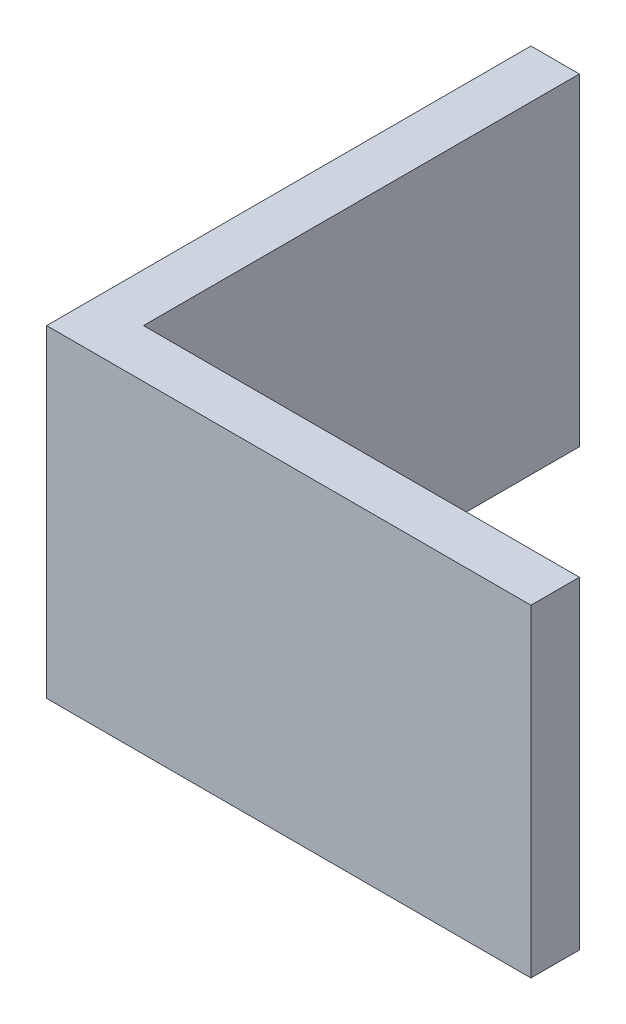
ISO-10303-21;
HEADER;
FILE_DESCRIPTION(('STEP AP214'),'2;1');
FILE_NAME('part.step','',(''),(''),'','','');
FILE_SCHEMA(('AUTOMOTIVE_DESIGN { 1 0 10303 214 1 1 1 1 }'));
ENDSEC;
DATA;
#1=APPLICATION_CONTEXT('core data for automotive mechanical design processes');
#2=APPLICATION_PROTOCOL_DEFINITION('international standard','automotive_design',2000,#1);
#3=PRODUCT_CONTEXT('',#1,'mechanical');
#4=PRODUCT('Part','Part','',(#3));
#5=PRODUCT_RELATED_PRODUCT_CATEGORY('part','',(#4));
#6=PRODUCT_DEFINITION_FORMATION('','',#4);
#7=PRODUCT_DEFINITION_CONTEXT('part definition',#1,'design');
#8=PRODUCT_DEFINITION('design','',#6,#7);
#9=PRODUCT_DEFINITION_SHAPE('','',#8);
#10=(LENGTH_UNIT() NAMED_UNIT(*) SI_UNIT(.MILLI.,.METRE.));
#11=(NAMED_UNIT(*) PLANE_ANGLE_UNIT() SI_UNIT($,.RADIAN.));
#12=(NAMED_UNIT(*) SI_UNIT($,.STERADIAN.) SOLID_ANGLE_UNIT());
#13=UNCERTAINTY_MEASURE_WITH_UNIT(LENGTH_MEASURE(1.E-05),#10,'distance_accuracy_value','');
#14=(GEOMETRIC_REPRESENTATION_CONTEXT(3) GLOBAL_UNCERTAINTY_ASSIGNED_CONTEXT((#13)) GLOBAL_UNIT_ASSIGNED_CONTEXT((#10,
#11,#12)) REPRESENTATION_CONTEXT('',''));
#15=CARTESIAN_POINT('',(0.,0.,0.));
#16=DIRECTION('',(0.,0.,1.));
#17=DIRECTION('',(1.,0.,0.));
#18=AXIS2_PLACEMENT_3D('',#15,#16,#17);
#19=CARTESIAN_POINT('',(0.,20.,0.));
#20=DIRECTION('',(0.,0.,1.));
#21=DIRECTION('',(1.,0.,0.));
#22=AXIS2_PLACEMENT_3D('',#19,#20,#21);
#23=PLANE('',#22);
#24=DIRECTION('',(-1.,0.,0.));
#25=VECTOR('',#24,1.);
#26=CARTESIAN_POINT('',(0.,0.,0.));
#27=LINE('',#26,#25);
#28=CARTESIAN_POINT('',(3.,0.,0.));
#29=VERTEX_POINT('',#28);
#30=CARTESIAN_POINT('',(0.,0.,0.));
#31=VERTEX_POINT('',#30);
#32=EDGE_CURVE('E132',#29,#31,#27,.T.);
#33=ORIENTED_EDGE('',*,*,#32,.T.);
#34=DIRECTION('',(0.,-1.,0.));
#35=VECTOR('',#34,1.);
#36=CARTESIAN_POINT('',(0.,20.,0.));
#37=LINE('',#36,#35);
#38=CARTESIAN_POINT('',(0.,20.,0.));
#39=VERTEX_POINT('',#38);
#40=EDGE_CURVE('E11',#39,#31,#37,.T.);
#41=ORIENTED_EDGE('',*,*,#40,.F.);
#42=DIRECTION('',(-1.,0.,0.));
#43=VECTOR('',#42,1.);
#44=CARTESIAN_POINT('',(0.,20.,0.));
#45=LINE('',#44,#43);
#46=CARTESIAN_POINT('',(3.,20.,0.));
#47=VERTEX_POINT('',#46);
#48=EDGE_CURVE('E148',#47,#39,#45,.T.);
#49=ORIENTED_EDGE('',*,*,#48,.F.);
#50=DIRECTION('',(0.,-1.,0.));
#51=VECTOR('',#50,1.);
#52=CARTESIAN_POINT('',(3.,20.,0.));
#53=LINE('',#52,#51);
#54=EDGE_CURVE('E128',#47,#29,#53,.T.);
#55=ORIENTED_EDGE('',*,*,#54,.T.);
#56=EDGE_LOOP('',(#33,#41,#49,#55));
#57=FACE_BOUND('',#56,.T.);
#58=ADVANCED_FACE('F43',(#57),#23,.F.);
#59=CARTESIAN_POINT('',(0.,20.,0.));
#60=DIRECTION('',(1.,0.,0.));
#61=DIRECTION('',(0.,0.,-1.));
#62=AXIS2_PLACEMENT_3D('',#59,#60,#61);
#63=PLANE('',#62);
#64=DIRECTION('',(0.,0.,1.));
#65=VECTOR('',#64,1.);
#66=CARTESIAN_POINT('',(0.,0.,0.));
#67=LINE('',#66,#65);
#68=CARTESIAN_POINT('',(0.,0.,30.));
#69=VERTEX_POINT('',#68);
#70=EDGE_CURVE('E136',#31,#69,#67,.T.);
#71=ORIENTED_EDGE('',*,*,#70,.T.);
#72=DIRECTION('',(0.,-1.,0.));
#73=VECTOR('',#72,1.);
#74=CARTESIAN_POINT('',(0.,20.,30.));
#75=LINE('',#74,#73);
#76=CARTESIAN_POINT('',(0.,20.,30.));
#77=VERTEX_POINT('',#76);
#78=EDGE_CURVE('E52',#77,#69,#75,.T.);
#79=ORIENTED_EDGE('',*,*,#78,.F.);
#80=DIRECTION('',(0.,0.,1.));
#81=VECTOR('',#80,1.);
#82=CARTESIAN_POINT('',(0.,20.,0.));
#83=LINE('',#82,#81);
#84=EDGE_CURVE('E97',#39,#77,#83,.T.);
#85=ORIENTED_EDGE('',*,*,#84,.F.);
#86=ORIENTED_EDGE('',*,*,#40,.T.);
#87=EDGE_LOOP('',(#71,#79,#85,#86));
#88=FACE_BOUND('',#87,.T.);
#89=ADVANCED_FACE('F176',(#88),#63,.F.);
#90=CARTESIAN_POINT('',(0.,20.,30.));
#91=DIRECTION('',(0.,0.,-1.));
#92=DIRECTION('',(-1.,0.,0.));
#93=AXIS2_PLACEMENT_3D('',#90,#91,#92);
#94=PLANE('',#93);
#95=DIRECTION('',(1.,0.,0.));
#96=VECTOR('',#95,1.);
#97=CARTESIAN_POINT('',(0.,0.,30.));
#98=LINE('',#97,#96);
#99=CARTESIAN_POINT('',(30.,0.,30.));
#100=VERTEX_POINT('',#99);
#101=EDGE_CURVE('E139',#69,#100,#98,.T.);
#102=ORIENTED_EDGE('',*,*,#101,.T.);
#103=DIRECTION('',(0.,-1.,0.));
#104=VECTOR('',#103,1.);
#105=CARTESIAN_POINT('',(30.,20.,30.));
#106=LINE('',#105,#104);
#107=CARTESIAN_POINT('',(30.,20.,30.));
#108=VERTEX_POINT('',#107);
#109=EDGE_CURVE('E121',#108,#100,#106,.T.);
#110=ORIENTED_EDGE('',*,*,#109,.F.);
#111=DIRECTION('',(1.,0.,0.));
#112=VECTOR('',#111,1.);
#113=CARTESIAN_POINT('',(0.,20.,30.));
#114=LINE('',#113,#112);
#115=EDGE_CURVE('E110',#77,#108,#114,.T.);
#116=ORIENTED_EDGE('',*,*,#115,.F.);
#117=ORIENTED_EDGE('',*,*,#78,.T.);
#118=EDGE_LOOP('',(#102,#110,#116,#117));
#119=FACE_BOUND('',#118,.T.);
#120=ADVANCED_FACE('F158',(#119),#94,.F.);
#121=CARTESIAN_POINT('',(30.,20.,30.));
#122=DIRECTION('',(-1.,0.,0.));
#123=DIRECTION('',(0.,0.,1.));
#124=AXIS2_PLACEMENT_3D('',#121,#122,#123);
#125=PLANE('',#124);
#126=DIRECTION('',(0.,0.,-1.));
#127=VECTOR('',#126,1.);
#128=CARTESIAN_POINT('',(30.,0.,30.));
#129=LINE('',#128,#127);
#130=CARTESIAN_POINT('',(30.,0.,27.));
#131=VERTEX_POINT('',#130);
#132=EDGE_CURVE('E119',#100,#131,#129,.T.);
#133=ORIENTED_EDGE('',*,*,#132,.T.);
#134=DIRECTION('',(0.,-1.,0.));
#135=VECTOR('',#134,1.);
#136=CARTESIAN_POINT('',(30.,20.,27.));
#137=LINE('',#136,#135);
#138=CARTESIAN_POINT('',(30.,20.,27.));
#139=VERTEX_POINT('',#138);
#140=EDGE_CURVE('E116',#139,#131,#137,.T.);
#141=ORIENTED_EDGE('',*,*,#140,.F.);
#142=DIRECTION('',(0.,0.,-1.));
#143=VECTOR('',#142,1.);
#144=CARTESIAN_POINT('',(30.,20.,30.));
#145=LINE('',#144,#143);
#146=EDGE_CURVE('E104',#108,#139,#145,.T.);
#147=ORIENTED_EDGE('',*,*,#146,.F.);
#148=ORIENTED_EDGE('',*,*,#109,.T.);
#149=EDGE_LOOP('',(#133,#141,#147,#148));
#150=FACE_BOUND('',#149,.T.);
#151=ADVANCED_FACE('F117',(#150),#125,.F.);
#152=CARTESIAN_POINT('',(3.,20.,27.));
#153=DIRECTION('',(0.,0.,1.));
#154=DIRECTION('',(1.,0.,0.));
#155=AXIS2_PLACEMENT_3D('',#152,#153,#154);
#156=PLANE('',#155);
#157=DIRECTION('',(-1.,0.,0.));
#158=VECTOR('',#157,1.);
#159=CARTESIAN_POINT('',(3.,0.,27.));
#160=LINE('',#159,#158);
#161=CARTESIAN_POINT('',(3.,0.,27.));
#162=VERTEX_POINT('',#161);
#163=EDGE_CURVE('E83',#131,#162,#160,.T.);
#164=ORIENTED_EDGE('',*,*,#163,.T.);
#165=DIRECTION('',(0.,-1.,0.));
#166=VECTOR('',#165,1.);
#167=CARTESIAN_POINT('',(3.,20.,27.));
#168=LINE('',#167,#166);
#169=CARTESIAN_POINT('',(3.,20.,27.));
#170=VERTEX_POINT('',#169);
#171=EDGE_CURVE('E122',#170,#162,#168,.T.);
#172=ORIENTED_EDGE('',*,*,#171,.F.);
#173=DIRECTION('',(-1.,0.,0.));
#174=VECTOR('',#173,1.);
#175=CARTESIAN_POINT('',(3.,20.,27.));
#176=LINE('',#175,#174);
#177=EDGE_CURVE('E108',#139,#170,#176,.T.);
#178=ORIENTED_EDGE('',*,*,#177,.F.);
#179=ORIENTED_EDGE('',*,*,#140,.T.);
#180=EDGE_LOOP('',(#164,#172,#178,#179));
#181=FACE_BOUND('',#180,.T.);
#182=ADVANCED_FACE('F124',(#181),#156,.F.);
#183=CARTESIAN_POINT('',(3.,20.,0.));
#184=DIRECTION('',(-1.,0.,0.));
#185=DIRECTION('',(0.,0.,1.));
#186=AXIS2_PLACEMENT_3D('',#183,#184,#185);
#187=PLANE('',#186);
#188=DIRECTION('',(0.,0.,-1.));
#189=VECTOR('',#188,1.);
#190=CARTESIAN_POINT('',(3.,0.,0.));
#191=LINE('',#190,#189);
#192=EDGE_CURVE('E89',#162,#29,#191,.T.);
#193=ORIENTED_EDGE('',*,*,#192,.T.);
#194=ORIENTED_EDGE('',*,*,#54,.F.);
#195=DIRECTION('',(0.,0.,-1.));
#196=VECTOR('',#195,1.);
#197=CARTESIAN_POINT('',(3.,20.,0.));
#198=LINE('',#197,#196);
#199=EDGE_CURVE('E60',#170,#47,#198,.T.);
#200=ORIENTED_EDGE('',*,*,#199,.F.);
#201=ORIENTED_EDGE('',*,*,#171,.T.);
#202=EDGE_LOOP('',(#193,#194,#200,#201));
#203=FACE_BOUND('',#202,.T.);
#204=ADVANCED_FACE('F165',(#203),#187,.F.);
#205=CARTESIAN_POINT('',(0.,20.,0.));
#206=DIRECTION('',(0.,-1.,0.));
#207=DIRECTION('',(0.,0.,-1.));
#208=AXIS2_PLACEMENT_3D('',#205,#206,#207);
#209=PLANE('',#208);
#210=ORIENTED_EDGE('',*,*,#48,.T.);
#211=ORIENTED_EDGE('',*,*,#84,.T.);
#212=ORIENTED_EDGE('',*,*,#115,.T.);
#213=ORIENTED_EDGE('',*,*,#146,.T.);
#214=ORIENTED_EDGE('',*,*,#177,.T.);
#215=ORIENTED_EDGE('',*,*,#199,.T.);
#216=EDGE_LOOP('',(#210,#211,#212,#213,#214,#215));
#217=FACE_BOUND('',#216,.T.);
#218=ADVANCED_FACE('F106',(#217),#209,.F.);
#219=CARTESIAN_POINT('',(0.,0.,0.));
#220=DIRECTION('',(0.,-1.,0.));
#221=DIRECTION('',(0.,0.,-1.));
#222=AXIS2_PLACEMENT_3D('',#219,#220,#221);
#223=PLANE('',#222);
#224=ORIENTED_EDGE('',*,*,#32,.F.);
#225=ORIENTED_EDGE('',*,*,#192,.F.);
#226=ORIENTED_EDGE('',*,*,#163,.F.);
#227=ORIENTED_EDGE('',*,*,#132,.F.);
#228=ORIENTED_EDGE('',*,*,#101,.F.);
#229=ORIENTED_EDGE('',*,*,#70,.F.);
#230=EDGE_LOOP('',(#224,#225,#226,#227,#228,#229));
#231=FACE_BOUND('',#230,.T.);
#232=ADVANCED_FACE('F161',(#231),#223,.T.);
#233=CLOSED_SHELL('',(#58,#89,#120,#151,#182,#204,#218,#232));
#234=MANIFOLD_SOLID_BREP('B2',#233);
#235=ADVANCED_BREP_SHAPE_REPRESENTATION('',(#18,#234),#14);
#236=SHAPE_DEFINITION_REPRESENTATION(#9,#235);
ENDSEC;
END-ISO-10303-21;
